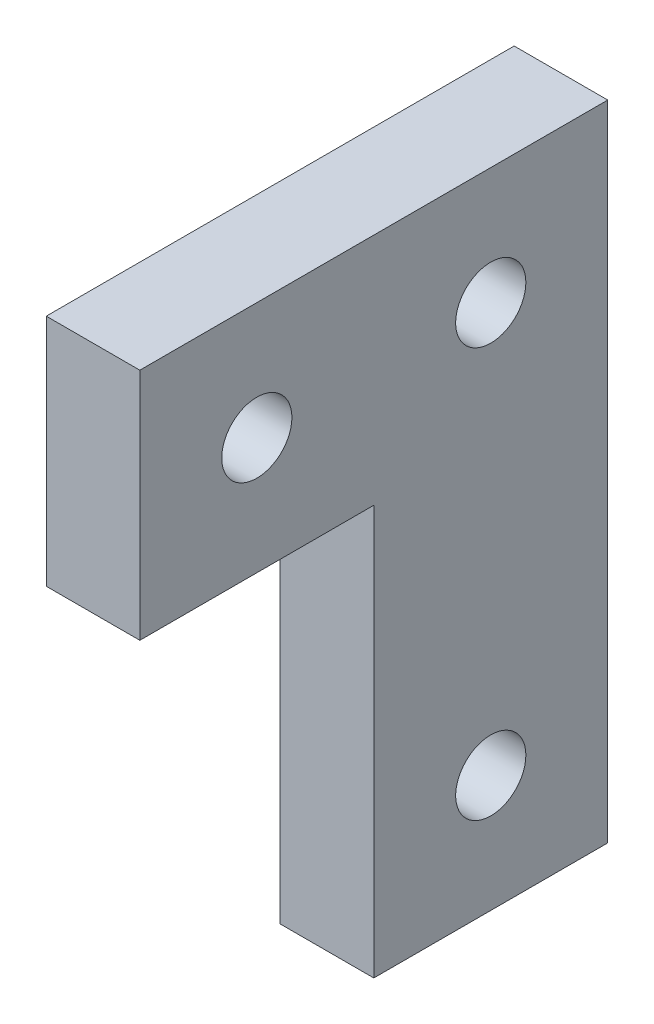
ISO-10303-21;
HEADER;
FILE_DESCRIPTION(('STEP AP214'),'2;1');
FILE_NAME('part.step','',(''),(''),'','','');
FILE_SCHEMA(('AUTOMOTIVE_DESIGN { 1 0 10303 214 1 1 1 1 }'));
ENDSEC;
DATA;
#1=APPLICATION_CONTEXT('core data for automotive mechanical design processes');
#2=APPLICATION_PROTOCOL_DEFINITION('international standard','automotive_design',2000,#1);
#3=PRODUCT_CONTEXT('',#1,'mechanical');
#4=PRODUCT('Part','Part','',(#3));
#5=PRODUCT_RELATED_PRODUCT_CATEGORY('part','',(#4));
#6=PRODUCT_DEFINITION_FORMATION('','',#4);
#7=PRODUCT_DEFINITION_CONTEXT('part definition',#1,'design');
#8=PRODUCT_DEFINITION('design','',#6,#7);
#9=PRODUCT_DEFINITION_SHAPE('','',#8);
#10=(LENGTH_UNIT() NAMED_UNIT(*) SI_UNIT(.MILLI.,.METRE.));
#11=(NAMED_UNIT(*) PLANE_ANGLE_UNIT() SI_UNIT($,.RADIAN.));
#12=(NAMED_UNIT(*) SI_UNIT($,.STERADIAN.) SOLID_ANGLE_UNIT());
#13=UNCERTAINTY_MEASURE_WITH_UNIT(LENGTH_MEASURE(1.E-05),#10,'distance_accuracy_value','');
#14=(GEOMETRIC_REPRESENTATION_CONTEXT(3) GLOBAL_UNCERTAINTY_ASSIGNED_CONTEXT((#13)) GLOBAL_UNIT_ASSIGNED_CONTEXT((#10,
#11,#12)) REPRESENTATION_CONTEXT('',''));
#15=CARTESIAN_POINT('',(0.,0.,0.));
#16=DIRECTION('',(0.,0.,1.));
#17=DIRECTION('',(1.,0.,0.));
#18=AXIS2_PLACEMENT_3D('',#15,#16,#17);
#19=CARTESIAN_POINT('',(1.6,0.,2.));
#20=DIRECTION('',(0.,0.,1.));
#21=DIRECTION('',(1.,0.,0.));
#22=AXIS2_PLACEMENT_3D('',#19,#20,#21);
#23=PLANE('',#22);
#24=DIRECTION('',(0.,1.,0.));
#25=VECTOR('',#24,1.);
#26=CARTESIAN_POINT('',(0.,0.,2.));
#27=LINE('',#26,#25);
#28=CARTESIAN_POINT('',(0.,-9.,2.));
#29=VERTEX_POINT('',#28);
#30=CARTESIAN_POINT('',(0.,-2.,2.));
#31=VERTEX_POINT('',#30);
#32=EDGE_CURVE('E130',#29,#31,#27,.T.);
#33=ORIENTED_EDGE('',*,*,#32,.F.);
#34=DIRECTION('',(-1.,0.,0.));
#35=VECTOR('',#34,1.);
#36=CARTESIAN_POINT('',(1.6,-9.,2.));
#37=LINE('',#36,#35);
#38=CARTESIAN_POINT('',(1.6,-9.,2.));
#39=VERTEX_POINT('',#38);
#40=EDGE_CURVE('E11',#39,#29,#37,.T.);
#41=ORIENTED_EDGE('',*,*,#40,.F.);
#42=DIRECTION('',(0.,1.,0.));
#43=VECTOR('',#42,1.);
#44=CARTESIAN_POINT('',(1.6,0.,2.));
#45=LINE('',#44,#43);
#46=CARTESIAN_POINT('',(1.6,-2.,2.));
#47=VERTEX_POINT('',#46);
#48=EDGE_CURVE('E194',#39,#47,#45,.T.);
#49=ORIENTED_EDGE('',*,*,#48,.T.);
#50=DIRECTION('',(-1.,0.,0.));
#51=VECTOR('',#50,1.);
#52=CARTESIAN_POINT('',(1.6,-2.,2.));
#53=LINE('',#52,#51);
#54=EDGE_CURVE('E81',#47,#31,#53,.T.);
#55=ORIENTED_EDGE('',*,*,#54,.T.);
#56=EDGE_LOOP('',(#33,#41,#49,#55));
#57=FACE_BOUND('',#56,.T.);
#58=ADVANCED_FACE('F35',(#57),#23,.T.);
#59=CARTESIAN_POINT('',(1.6,-9.,0.));
#60=DIRECTION('',(0.,1.,0.));
#61=DIRECTION('',(0.,0.,1.));
#62=AXIS2_PLACEMENT_3D('',#59,#60,#61);
#63=PLANE('',#62);
#64=DIRECTION('',(0.,0.,-1.));
#65=VECTOR('',#64,1.);
#66=CARTESIAN_POINT('',(0.,-9.,0.));
#67=LINE('',#66,#65);
#68=CARTESIAN_POINT('',(0.,-9.,-2.));
#69=VERTEX_POINT('',#68);
#70=EDGE_CURVE('E132',#29,#69,#67,.T.);
#71=ORIENTED_EDGE('',*,*,#70,.T.);
#72=DIRECTION('',(-1.,0.,0.));
#73=VECTOR('',#72,1.);
#74=CARTESIAN_POINT('',(1.6,-9.,-2.));
#75=LINE('',#74,#73);
#76=CARTESIAN_POINT('',(1.6,-9.,-2.));
#77=VERTEX_POINT('',#76);
#78=EDGE_CURVE('E44',#77,#69,#75,.T.);
#79=ORIENTED_EDGE('',*,*,#78,.F.);
#80=DIRECTION('',(0.,0.,-1.));
#81=VECTOR('',#80,1.);
#82=CARTESIAN_POINT('',(1.6,-9.,0.));
#83=LINE('',#82,#81);
#84=EDGE_CURVE('E116',#39,#77,#83,.T.);
#85=ORIENTED_EDGE('',*,*,#84,.F.);
#86=ORIENTED_EDGE('',*,*,#40,.T.);
#87=EDGE_LOOP('',(#71,#79,#85,#86));
#88=FACE_BOUND('',#87,.T.);
#89=ADVANCED_FACE('F151',(#88),#63,.F.);
#90=CARTESIAN_POINT('',(1.6,0.,-2.));
#91=DIRECTION('',(0.,0.,-1.));
#92=DIRECTION('',(0.,1.,0.));
#93=AXIS2_PLACEMENT_3D('',#90,#91,#92);
#94=PLANE('',#93);
#95=DIRECTION('',(0.,-1.,0.));
#96=VECTOR('',#95,1.);
#97=CARTESIAN_POINT('',(0.,0.,-2.));
#98=LINE('',#97,#96);
#99=CARTESIAN_POINT('',(0.,2.,-2.));
#100=VERTEX_POINT('',#99);
#101=EDGE_CURVE('E135',#100,#69,#98,.T.);
#102=ORIENTED_EDGE('',*,*,#101,.F.);
#103=DIRECTION('',(-1.,0.,0.));
#104=VECTOR('',#103,1.);
#105=CARTESIAN_POINT('',(1.6,2.,-2.));
#106=LINE('',#105,#104);
#107=CARTESIAN_POINT('',(1.6,2.,-2.));
#108=VERTEX_POINT('',#107);
#109=EDGE_CURVE('E104',#108,#100,#106,.T.);
#110=ORIENTED_EDGE('',*,*,#109,.F.);
#111=DIRECTION('',(0.,-1.,0.));
#112=VECTOR('',#111,1.);
#113=CARTESIAN_POINT('',(1.6,0.,-2.));
#114=LINE('',#113,#112);
#115=EDGE_CURVE('E114',#108,#77,#114,.T.);
#116=ORIENTED_EDGE('',*,*,#115,.T.);
#117=ORIENTED_EDGE('',*,*,#78,.T.);
#118=EDGE_LOOP('',(#102,#110,#116,#117));
#119=FACE_BOUND('',#118,.T.);
#120=ADVANCED_FACE('F148',(#119),#94,.T.);
#121=CARTESIAN_POINT('',(1.6,2.,0.));
#122=DIRECTION('',(0.,1.,0.));
#123=DIRECTION('',(0.,0.,1.));
#124=AXIS2_PLACEMENT_3D('',#121,#122,#123);
#125=PLANE('',#124);
#126=DIRECTION('',(0.,0.,-1.));
#127=VECTOR('',#126,1.);
#128=CARTESIAN_POINT('',(0.,2.,0.));
#129=LINE('',#128,#127);
#130=CARTESIAN_POINT('',(0.,2.,6.));
#131=VERTEX_POINT('',#130);
#132=EDGE_CURVE('E101',#131,#100,#129,.T.);
#133=ORIENTED_EDGE('',*,*,#132,.F.);
#134=DIRECTION('',(-1.,0.,0.));
#135=VECTOR('',#134,1.);
#136=CARTESIAN_POINT('',(1.6,2.,6.));
#137=LINE('',#136,#135);
#138=CARTESIAN_POINT('',(1.6,2.,6.));
#139=VERTEX_POINT('',#138);
#140=EDGE_CURVE('E95',#139,#131,#137,.T.);
#141=ORIENTED_EDGE('',*,*,#140,.F.);
#142=DIRECTION('',(0.,0.,-1.));
#143=VECTOR('',#142,1.);
#144=CARTESIAN_POINT('',(1.6,2.,0.));
#145=LINE('',#144,#143);
#146=EDGE_CURVE('E99',#139,#108,#145,.T.);
#147=ORIENTED_EDGE('',*,*,#146,.T.);
#148=ORIENTED_EDGE('',*,*,#109,.T.);
#149=EDGE_LOOP('',(#133,#141,#147,#148));
#150=FACE_BOUND('',#149,.T.);
#151=ADVANCED_FACE('F97',(#150),#125,.T.);
#152=CARTESIAN_POINT('',(1.6,0.,6.));
#153=DIRECTION('',(0.,0.,-1.));
#154=DIRECTION('',(0.,1.,0.));
#155=AXIS2_PLACEMENT_3D('',#152,#153,#154);
#156=PLANE('',#155);
#157=DIRECTION('',(0.,-1.,0.));
#158=VECTOR('',#157,1.);
#159=CARTESIAN_POINT('',(0.,0.,6.));
#160=LINE('',#159,#158);
#161=CARTESIAN_POINT('',(0.,-2.,6.));
#162=VERTEX_POINT('',#161);
#163=EDGE_CURVE('E139',#131,#162,#160,.T.);
#164=ORIENTED_EDGE('',*,*,#163,.T.);
#165=DIRECTION('',(-1.,0.,0.));
#166=VECTOR('',#165,1.);
#167=CARTESIAN_POINT('',(1.6,-2.,6.));
#168=LINE('',#167,#166);
#169=CARTESIAN_POINT('',(1.6,-2.,6.));
#170=VERTEX_POINT('',#169);
#171=EDGE_CURVE('E105',#170,#162,#168,.T.);
#172=ORIENTED_EDGE('',*,*,#171,.F.);
#173=DIRECTION('',(0.,-1.,0.));
#174=VECTOR('',#173,1.);
#175=CARTESIAN_POINT('',(1.6,0.,6.));
#176=LINE('',#175,#174);
#177=EDGE_CURVE('E108',#139,#170,#176,.T.);
#178=ORIENTED_EDGE('',*,*,#177,.F.);
#179=ORIENTED_EDGE('',*,*,#140,.T.);
#180=EDGE_LOOP('',(#164,#172,#178,#179));
#181=FACE_BOUND('',#180,.T.);
#182=ADVANCED_FACE('F109',(#181),#156,.F.);
#183=CARTESIAN_POINT('',(1.6,0.,0.));
#184=DIRECTION('',(-1.,0.,0.));
#185=DIRECTION('',(0.,0.,1.));
#186=AXIS2_PLACEMENT_3D('',#183,#184,#185);
#187=CYLINDRICAL_SURFACE('',#186,0.6);
#188=CARTESIAN_POINT('',(1.6,0.,0.));
#189=DIRECTION('',(1.,0.,0.));
#190=DIRECTION('',(0.,0.,-1.));
#191=AXIS2_PLACEMENT_3D('',#188,#189,#190);
#192=CIRCLE('',#191,0.6);
#193=CARTESIAN_POINT('',(1.6,0.,-0.6));
#194=VERTEX_POINT('',#193);
#195=EDGE_CURVE('E191',#194,#194,#192,.T.);
#196=ORIENTED_EDGE('',*,*,#195,.T.);
#197=EDGE_LOOP('',(#196));
#198=FACE_BOUND('',#197,.T.);
#199=CARTESIAN_POINT('',(0.,0.,0.));
#200=DIRECTION('',(1.,0.,0.));
#201=DIRECTION('',(0.,0.,-1.));
#202=AXIS2_PLACEMENT_3D('',#199,#200,#201);
#203=CIRCLE('',#202,0.6);
#204=CARTESIAN_POINT('',(0.,0.,-0.6));
#205=VERTEX_POINT('',#204);
#206=EDGE_CURVE('E127',#205,#205,#203,.T.);
#207=ORIENTED_EDGE('',*,*,#206,.F.);
#208=EDGE_LOOP('',(#207));
#209=FACE_BOUND('',#208,.T.);
#210=ADVANCED_FACE('F172',(#198,#209),#187,.F.);
#211=CARTESIAN_POINT('',(1.6,0.,4.));
#212=DIRECTION('',(-1.,0.,0.));
#213=DIRECTION('',(0.,0.,1.));
#214=AXIS2_PLACEMENT_3D('',#211,#212,#213);
#215=CYLINDRICAL_SURFACE('',#214,0.6);
#216=CARTESIAN_POINT('',(1.6,0.,4.));
#217=DIRECTION('',(1.,0.,0.));
#218=DIRECTION('',(0.,0.,-1.));
#219=AXIS2_PLACEMENT_3D('',#216,#217,#218);
#220=CIRCLE('',#219,0.6);
#221=CARTESIAN_POINT('',(1.6,0.,3.4));
#222=VERTEX_POINT('',#221);
#223=EDGE_CURVE('E185',#222,#222,#220,.T.);
#224=ORIENTED_EDGE('',*,*,#223,.T.);
#225=EDGE_LOOP('',(#224));
#226=FACE_BOUND('',#225,.T.);
#227=CARTESIAN_POINT('',(0.,0.,4.));
#228=DIRECTION('',(1.,0.,0.));
#229=DIRECTION('',(0.,0.,-1.));
#230=AXIS2_PLACEMENT_3D('',#227,#228,#229);
#231=CIRCLE('',#230,0.6);
#232=CARTESIAN_POINT('',(0.,0.,3.4));
#233=VERTEX_POINT('',#232);
#234=EDGE_CURVE('E124',#233,#233,#231,.T.);
#235=ORIENTED_EDGE('',*,*,#234,.F.);
#236=EDGE_LOOP('',(#235));
#237=FACE_BOUND('',#236,.T.);
#238=ADVANCED_FACE('F174',(#226,#237),#215,.F.);
#239=CARTESIAN_POINT('',(1.6,-7.,0.));
#240=DIRECTION('',(-1.,0.,0.));
#241=DIRECTION('',(0.,0.,1.));
#242=AXIS2_PLACEMENT_3D('',#239,#240,#241);
#243=CYLINDRICAL_SURFACE('',#242,0.6);
#244=CARTESIAN_POINT('',(1.6,-7.,0.));
#245=DIRECTION('',(1.,0.,0.));
#246=DIRECTION('',(0.,0.,-1.));
#247=AXIS2_PLACEMENT_3D('',#244,#245,#246);
#248=CIRCLE('',#247,0.6);
#249=CARTESIAN_POINT('',(1.6,-7.,-0.6));
#250=VERTEX_POINT('',#249);
#251=EDGE_CURVE('E142',#250,#250,#248,.T.);
#252=ORIENTED_EDGE('',*,*,#251,.T.);
#253=EDGE_LOOP('',(#252));
#254=FACE_BOUND('',#253,.T.);
#255=CARTESIAN_POINT('',(0.,-7.,0.));
#256=DIRECTION('',(1.,0.,0.));
#257=DIRECTION('',(0.,0.,-1.));
#258=AXIS2_PLACEMENT_3D('',#255,#256,#257);
#259=CIRCLE('',#258,0.6);
#260=CARTESIAN_POINT('',(0.,-7.,-0.6));
#261=VERTEX_POINT('',#260);
#262=EDGE_CURVE('E121',#261,#261,#259,.T.);
#263=ORIENTED_EDGE('',*,*,#262,.F.);
#264=EDGE_LOOP('',(#263));
#265=FACE_BOUND('',#264,.T.);
#266=ADVANCED_FACE('F37',(#254,#265),#243,.F.);
#267=CARTESIAN_POINT('',(1.6,-2.,0.));
#268=DIRECTION('',(0.,1.,0.));
#269=DIRECTION('',(0.,0.,1.));
#270=AXIS2_PLACEMENT_3D('',#267,#268,#269);
#271=PLANE('',#270);
#272=DIRECTION('',(0.,0.,-1.));
#273=VECTOR('',#272,1.);
#274=CARTESIAN_POINT('',(0.,-2.,0.));
#275=LINE('',#274,#273);
#276=EDGE_CURVE('E74',#162,#31,#275,.T.);
#277=ORIENTED_EDGE('',*,*,#276,.T.);
#278=ORIENTED_EDGE('',*,*,#54,.F.);
#279=DIRECTION('',(0.,0.,-1.));
#280=VECTOR('',#279,1.);
#281=CARTESIAN_POINT('',(1.6,-2.,0.));
#282=LINE('',#281,#280);
#283=EDGE_CURVE('E52',#170,#47,#282,.T.);
#284=ORIENTED_EDGE('',*,*,#283,.F.);
#285=ORIENTED_EDGE('',*,*,#171,.T.);
#286=EDGE_LOOP('',(#277,#278,#284,#285));
#287=FACE_BOUND('',#286,.T.);
#288=ADVANCED_FACE('F159',(#287),#271,.F.);
#289=CARTESIAN_POINT('',(1.6,0.,0.));
#290=DIRECTION('',(1.,0.,0.));
#291=DIRECTION('',(0.,0.,-1.));
#292=AXIS2_PLACEMENT_3D('',#289,#290,#291);
#293=PLANE('',#292);
#294=ORIENTED_EDGE('',*,*,#251,.F.);
#295=EDGE_LOOP('',(#294));
#296=FACE_BOUND('',#295,.T.);
#297=ORIENTED_EDGE('',*,*,#223,.F.);
#298=EDGE_LOOP('',(#297));
#299=FACE_BOUND('',#298,.T.);
#300=ORIENTED_EDGE('',*,*,#195,.F.);
#301=EDGE_LOOP('',(#300));
#302=FACE_BOUND('',#301,.T.);
#303=ORIENTED_EDGE('',*,*,#48,.F.);
#304=ORIENTED_EDGE('',*,*,#84,.T.);
#305=ORIENTED_EDGE('',*,*,#115,.F.);
#306=ORIENTED_EDGE('',*,*,#146,.F.);
#307=ORIENTED_EDGE('',*,*,#177,.T.);
#308=ORIENTED_EDGE('',*,*,#283,.T.);
#309=EDGE_LOOP('',(#303,#304,#305,#306,#307,#308));
#310=FACE_BOUND('',#309,.T.);
#311=ADVANCED_FACE('F112',(#296,#299,#302,#310),#293,.T.);
#312=CARTESIAN_POINT('',(0.,0.,0.));
#313=DIRECTION('',(1.,0.,0.));
#314=DIRECTION('',(0.,0.,-1.));
#315=AXIS2_PLACEMENT_3D('',#312,#313,#314);
#316=PLANE('',#315);
#317=ORIENTED_EDGE('',*,*,#262,.T.);
#318=EDGE_LOOP('',(#317));
#319=FACE_BOUND('',#318,.T.);
#320=ORIENTED_EDGE('',*,*,#234,.T.);
#321=EDGE_LOOP('',(#320));
#322=FACE_BOUND('',#321,.T.);
#323=ORIENTED_EDGE('',*,*,#206,.T.);
#324=EDGE_LOOP('',(#323));
#325=FACE_BOUND('',#324,.T.);
#326=ORIENTED_EDGE('',*,*,#32,.T.);
#327=ORIENTED_EDGE('',*,*,#276,.F.);
#328=ORIENTED_EDGE('',*,*,#163,.F.);
#329=ORIENTED_EDGE('',*,*,#132,.T.);
#330=ORIENTED_EDGE('',*,*,#101,.T.);
#331=ORIENTED_EDGE('',*,*,#70,.F.);
#332=EDGE_LOOP('',(#326,#327,#328,#329,#330,#331));
#333=FACE_BOUND('',#332,.T.);
#334=ADVANCED_FACE('F152',(#319,#322,#325,#333),#316,.F.);
#335=CLOSED_SHELL('',(#58,#89,#120,#151,#182,#210,#238,#266,#288,#311,#334));
#336=MANIFOLD_SOLID_BREP('B2',#335);
#337=ADVANCED_BREP_SHAPE_REPRESENTATION('',(#18,#336),#14);
#338=SHAPE_DEFINITION_REPRESENTATION(#9,#337);
ENDSEC;
END-ISO-10303-21;
